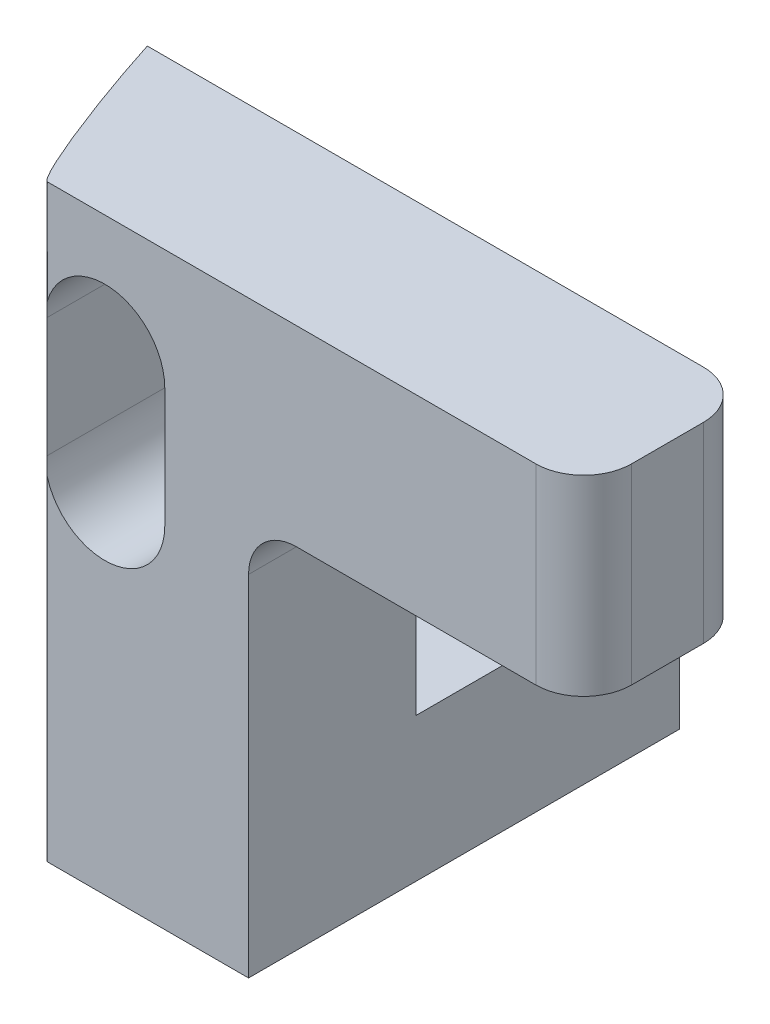
ISO-10303-21;
HEADER;
FILE_DESCRIPTION(('STEP AP214'),'2;1');
FILE_NAME('part.step','',(''),(''),'','','');
FILE_SCHEMA(('AUTOMOTIVE_DESIGN { 1 0 10303 214 1 1 1 1 }'));
ENDSEC;
DATA;
#1=APPLICATION_CONTEXT('core data for automotive mechanical design processes');
#2=APPLICATION_PROTOCOL_DEFINITION('international standard','automotive_design',2000,#1);
#3=PRODUCT_CONTEXT('',#1,'mechanical');
#4=PRODUCT('Part','Part','',(#3));
#5=PRODUCT_RELATED_PRODUCT_CATEGORY('part','',(#4));
#6=PRODUCT_DEFINITION_FORMATION('','',#4);
#7=PRODUCT_DEFINITION_CONTEXT('part definition',#1,'design');
#8=PRODUCT_DEFINITION('design','',#6,#7);
#9=PRODUCT_DEFINITION_SHAPE('','',#8);
#10=(LENGTH_UNIT() NAMED_UNIT(*) SI_UNIT(.MILLI.,.METRE.));
#11=(NAMED_UNIT(*) PLANE_ANGLE_UNIT() SI_UNIT($,.RADIAN.));
#12=(NAMED_UNIT(*) SI_UNIT($,.STERADIAN.) SOLID_ANGLE_UNIT());
#13=UNCERTAINTY_MEASURE_WITH_UNIT(LENGTH_MEASURE(1.E-05),#10,'distance_accuracy_value','');
#14=(GEOMETRIC_REPRESENTATION_CONTEXT(3) GLOBAL_UNCERTAINTY_ASSIGNED_CONTEXT((#13)) GLOBAL_UNIT_ASSIGNED_CONTEXT((#10,
#11,#12)) REPRESENTATION_CONTEXT('',''));
#15=CARTESIAN_POINT('',(0.,0.,0.));
#16=DIRECTION('',(0.,0.,1.));
#17=DIRECTION('',(1.,0.,0.));
#18=AXIS2_PLACEMENT_3D('',#15,#16,#17);
#19=CARTESIAN_POINT('',(0.,3.,0.));
#20=DIRECTION('',(0.,-1.,0.));
#21=DIRECTION('',(0.,0.,-1.));
#22=AXIS2_PLACEMENT_3D('',#19,#20,#21);
#23=PLANE('',#22);
#24=CARTESIAN_POINT('',(0.,3.,0.));
#25=DIRECTION('',(0.,1.,0.));
#26=DIRECTION('',(0.,0.,1.));
#27=AXIS2_PLACEMENT_3D('',#24,#25,#26);
#28=CIRCLE('',#27,1.5);
#29=CARTESIAN_POINT('',(0.,3.,1.5));
#30=VERTEX_POINT('',#29);
#31=EDGE_CURVE('E344',#30,#30,#28,.T.);
#32=ORIENTED_EDGE('',*,*,#31,.F.);
#33=EDGE_LOOP('',(#32));
#34=FACE_BOUND('',#33,.T.);
#35=DIRECTION('',(0.,0.,1.));
#36=VECTOR('',#35,1.);
#37=CARTESIAN_POINT('',(-3.,3.,6.5));
#38=LINE('',#37,#36);
#39=CARTESIAN_POINT('',(-3.,3.,-1.5));
#40=VERTEX_POINT('',#39);
#41=CARTESIAN_POINT('',(-3.,3.,1.5));
#42=VERTEX_POINT('',#41);
#43=EDGE_CURVE('E354',#40,#42,#38,.T.);
#44=ORIENTED_EDGE('',*,*,#43,.T.);
#45=CARTESIAN_POINT('',(-1.2,3.,6.5));
#46=CARTESIAN_POINT('',(-3.,3.,6.5));
#47=CARTESIAN_POINT('',(-3.,3.,1.5));
#48=(BOUNDED_CURVE() B_SPLINE_CURVE(2,(#45,#46,#47),.UNSPECIFIED.,.F.,
.F.) B_SPLINE_CURVE_WITH_KNOTS((3,3),(0.,1.),
.UNSPECIFIED.) CURVE() GEOMETRIC_REPRESENTATION_ITEM() RATIONAL_B_SPLINE_CURVE((1.,
0.111111111111111,1.)) REPRESENTATION_ITEM(''));
#49=CARTESIAN_POINT('',(-2.6148133392298,3.,3.));
#50=VERTEX_POINT('',#49);
#51=EDGE_CURVE('E67',#42,#50,#48,.F.);
#52=ORIENTED_EDGE('',*,*,#51,.T.);
#53=DIRECTION('',(-1.,0.,0.));
#54=VECTOR('',#53,1.);
#55=CARTESIAN_POINT('',(-3.,3.,3.));
#56=LINE('',#55,#54);
#57=CARTESIAN_POINT('',(3.,3.,3.));
#58=VERTEX_POINT('',#57);
#59=EDGE_CURVE('E327',#58,#50,#56,.T.);
#60=ORIENTED_EDGE('',*,*,#59,.F.);
#61=DIRECTION('',(0.,0.,-1.));
#62=VECTOR('',#61,1.);
#63=CARTESIAN_POINT('',(3.,3.,6.5));
#64=LINE('',#63,#62);
#65=CARTESIAN_POINT('',(3.,3.,-2.5));
#66=VERTEX_POINT('',#65);
#67=EDGE_CURVE('E292',#58,#66,#64,.T.);
#68=ORIENTED_EDGE('',*,*,#67,.T.);
#69=DIRECTION('',(-1.,0.,0.));
#70=VECTOR('',#69,1.);
#71=CARTESIAN_POINT('',(-3.,3.,-2.5));
#72=LINE('',#71,#70);
#73=CARTESIAN_POINT('',(-2.,3.,-2.5));
#74=VERTEX_POINT('',#73);
#75=EDGE_CURVE('E351',#66,#74,#72,.T.);
#76=ORIENTED_EDGE('',*,*,#75,.T.);
#77=CARTESIAN_POINT('',(-2.,3.,-1.5));
#78=DIRECTION('',(0.,-1.,0.));
#79=DIRECTION('',(0.,0.,-1.));
#80=AXIS2_PLACEMENT_3D('',#77,#78,#79);
#81=CIRCLE('',#80,1.);
#82=EDGE_CURVE('E383',#74,#40,#81,.F.);
#83=ORIENTED_EDGE('',*,*,#82,.T.);
#84=EDGE_LOOP('',(#44,#52,#60,#68,#76,#83));
#85=FACE_BOUND('',#84,.T.);
#86=ADVANCED_FACE('F38',(#34,#85),#23,.F.);
#87=CARTESIAN_POINT('',(0.,0.,0.));
#88=DIRECTION('',(0.,-1.,0.));
#89=DIRECTION('',(0.,0.,-1.));
#90=AXIS2_PLACEMENT_3D('',#87,#88,#89);
#91=PLANE('',#90);
#92=DIRECTION('',(1.,0.,0.));
#93=VECTOR('',#92,1.);
#94=CARTESIAN_POINT('',(-3.,0.,6.5));
#95=LINE('',#94,#93);
#96=CARTESIAN_POINT('',(-1.2,0.,6.5));
#97=VERTEX_POINT('',#96);
#98=CARTESIAN_POINT('',(3.,0.,6.5));
#99=VERTEX_POINT('',#98);
#100=EDGE_CURVE('E278',#97,#99,#95,.T.);
#101=ORIENTED_EDGE('',*,*,#100,.F.);
#102=CARTESIAN_POINT('',(-3.,0.,1.5));
#103=CARTESIAN_POINT('',(-3.,0.,6.5));
#104=CARTESIAN_POINT('',(-1.2,0.,6.5));
#105=(BOUNDED_CURVE() B_SPLINE_CURVE(2,(#102,#103,#104),.UNSPECIFIED.,.F.,
.F.) B_SPLINE_CURVE_WITH_KNOTS((3,3),(0.,1.),
.UNSPECIFIED.) CURVE() GEOMETRIC_REPRESENTATION_ITEM() RATIONAL_B_SPLINE_CURVE((1.,
0.111111111111111,1.)) REPRESENTATION_ITEM(''));
#106=CARTESIAN_POINT('',(-3.,0.,1.5));
#107=VERTEX_POINT('',#106);
#108=EDGE_CURVE('E420',#97,#107,#105,.F.);
#109=ORIENTED_EDGE('',*,*,#108,.T.);
#110=DIRECTION('',(0.,0.,1.));
#111=VECTOR('',#110,1.);
#112=CARTESIAN_POINT('',(-3.,0.,6.5));
#113=LINE('',#112,#111);
#114=CARTESIAN_POINT('',(-3.,0.,-1.5));
#115=VERTEX_POINT('',#114);
#116=EDGE_CURVE('E269',#115,#107,#113,.T.);
#117=ORIENTED_EDGE('',*,*,#116,.F.);
#118=CARTESIAN_POINT('',(-2.,0.,-1.5));
#119=DIRECTION('',(0.,-1.,0.));
#120=DIRECTION('',(0.,0.,-1.));
#121=AXIS2_PLACEMENT_3D('',#118,#119,#120);
#122=CIRCLE('',#121,1.);
#123=CARTESIAN_POINT('',(-2.,0.,-2.5));
#124=VERTEX_POINT('',#123);
#125=EDGE_CURVE('E377',#115,#124,#122,.T.);
#126=ORIENTED_EDGE('',*,*,#125,.T.);
#127=DIRECTION('',(-1.,0.,0.));
#128=VECTOR('',#127,1.);
#129=CARTESIAN_POINT('',(-3.,0.,-2.5));
#130=LINE('',#129,#128);
#131=CARTESIAN_POINT('',(3.,0.,-2.5));
#132=VERTEX_POINT('',#131);
#133=EDGE_CURVE('E279',#132,#124,#130,.T.);
#134=ORIENTED_EDGE('',*,*,#133,.F.);
#135=DIRECTION('',(0.,0.,-1.));
#136=VECTOR('',#135,1.);
#137=CARTESIAN_POINT('',(3.,0.,6.5));
#138=LINE('',#137,#136);
#139=EDGE_CURVE('E347',#99,#132,#138,.T.);
#140=ORIENTED_EDGE('',*,*,#139,.F.);
#141=EDGE_LOOP('',(#101,#109,#117,#126,#134,#140));
#142=FACE_BOUND('',#141,.T.);
#143=CARTESIAN_POINT('',(0.,0.,0.));
#144=DIRECTION('',(0.,1.,0.));
#145=DIRECTION('',(0.,0.,1.));
#146=AXIS2_PLACEMENT_3D('',#143,#144,#145);
#147=CIRCLE('',#146,1.5);
#148=CARTESIAN_POINT('',(0.,0.,1.5));
#149=VERTEX_POINT('',#148);
#150=EDGE_CURVE('E343',#149,#149,#147,.T.);
#151=ORIENTED_EDGE('',*,*,#150,.T.);
#152=EDGE_LOOP('',(#151));
#153=FACE_BOUND('',#152,.T.);
#154=ADVANCED_FACE('F311',(#142,#153),#91,.T.);
#155=CARTESIAN_POINT('',(3.,3.,6.5));
#156=DIRECTION('',(-1.,0.,0.));
#157=DIRECTION('',(0.,0.,1.));
#158=AXIS2_PLACEMENT_3D('',#155,#156,#157);
#159=PLANE('',#158);
#160=DIRECTION('',(0.,-1.,0.));
#161=VECTOR('',#160,1.);
#162=CARTESIAN_POINT('',(3.,8.3,3.));
#163=LINE('',#162,#161);
#164=CARTESIAN_POINT('',(3.,7.3,3.));
#165=VERTEX_POINT('',#164);
#166=EDGE_CURVE('E334',#165,#58,#163,.T.);
#167=ORIENTED_EDGE('',*,*,#166,.F.);
#168=DIRECTION('',(0.,0.,-1.));
#169=VECTOR('',#168,1.);
#170=CARTESIAN_POINT('',(3.,7.3,6.5));
#171=LINE('',#170,#169);
#172=CARTESIAN_POINT('',(3.,7.3,6.5));
#173=VERTEX_POINT('',#172);
#174=EDGE_CURVE('E388',#165,#173,#171,.F.);
#175=ORIENTED_EDGE('',*,*,#174,.T.);
#176=DIRECTION('',(0.,-1.,0.));
#177=VECTOR('',#176,1.);
#178=CARTESIAN_POINT('',(3.,3.,6.5));
#179=LINE('',#178,#177);
#180=EDGE_CURVE('E287',#173,#99,#179,.T.);
#181=ORIENTED_EDGE('',*,*,#180,.T.);
#182=ORIENTED_EDGE('',*,*,#139,.T.);
#183=DIRECTION('',(0.,-1.,0.));
#184=VECTOR('',#183,1.);
#185=CARTESIAN_POINT('',(3.,3.,-2.5));
#186=LINE('',#185,#184);
#187=EDGE_CURVE('E365',#66,#132,#186,.T.);
#188=ORIENTED_EDGE('',*,*,#187,.F.);
#189=ORIENTED_EDGE('',*,*,#67,.F.);
#190=EDGE_LOOP('',(#167,#175,#181,#182,#188,#189));
#191=FACE_BOUND('',#190,.T.);
#192=ADVANCED_FACE('F509',(#191),#159,.F.);
#193=CARTESIAN_POINT('',(-3.,3.,-2.5));
#194=DIRECTION('',(0.,0.,1.));
#195=DIRECTION('',(1.,0.,0.));
#196=AXIS2_PLACEMENT_3D('',#193,#194,#195);
#197=PLANE('',#196);
#198=ORIENTED_EDGE('',*,*,#133,.T.);
#199=DIRECTION('',(0.,-1.,0.));
#200=VECTOR('',#199,1.);
#201=CARTESIAN_POINT('',(-2.,3.,-2.5));
#202=LINE('',#201,#200);
#203=EDGE_CURVE('E381',#124,#74,#202,.F.);
#204=ORIENTED_EDGE('',*,*,#203,.T.);
#205=ORIENTED_EDGE('',*,*,#75,.F.);
#206=ORIENTED_EDGE('',*,*,#187,.T.);
#207=EDGE_LOOP('',(#198,#204,#205,#206));
#208=FACE_BOUND('',#207,.T.);
#209=ADVANCED_FACE('F318',(#208),#197,.F.);
#210=CARTESIAN_POINT('',(-3.,3.,6.5));
#211=DIRECTION('',(1.,0.,0.));
#212=DIRECTION('',(0.,0.,-1.));
#213=AXIS2_PLACEMENT_3D('',#210,#211,#212);
#214=PLANE('',#213);
#215=ORIENTED_EDGE('',*,*,#116,.T.);
#216=CARTESIAN_POINT('',(-3.,12.915,1.5));
#217=CARTESIAN_POINT('',(-3.,8.40499999999999,1.5));
#218=CARTESIAN_POINT('',(-3.,3.895,1.5));
#219=CARTESIAN_POINT('',(-3.,-0.615000000000001,1.5));
#220=(BOUNDED_CURVE() B_SPLINE_CURVE(3,(#216,#217,#218,#219),.UNSPECIFIED.,.F.,
.F.) B_SPLINE_CURVE_WITH_KNOTS((4,4),(-0.009915,0.003615),
.UNSPECIFIED.) CURVE() GEOMETRIC_REPRESENTATION_ITEM() RATIONAL_B_SPLINE_CURVE((1.,1.,1.,1.)) REPRESENTATION_ITEM(''));
#221=EDGE_CURVE('E497',#107,#42,#220,.F.);
#222=ORIENTED_EDGE('',*,*,#221,.T.);
#223=ORIENTED_EDGE('',*,*,#43,.F.);
#224=DIRECTION('',(0.,-1.,0.));
#225=VECTOR('',#224,1.);
#226=CARTESIAN_POINT('',(-3.,3.,-1.5));
#227=LINE('',#226,#225);
#228=EDGE_CURVE('E371',#40,#115,#227,.T.);
#229=ORIENTED_EDGE('',*,*,#228,.T.);
#230=EDGE_LOOP('',(#215,#222,#223,#229));
#231=FACE_BOUND('',#230,.T.);
#232=ADVANCED_FACE('F310',(#231),#214,.F.);
#233=CARTESIAN_POINT('',(-3.,3.,6.5));
#234=DIRECTION('',(0.,0.,-1.));
#235=DIRECTION('',(-1.,0.,0.));
#236=AXIS2_PLACEMENT_3D('',#233,#234,#235);
#237=PLANE('',#236);
#238=DIRECTION('',(1.,0.,0.));
#239=VECTOR('',#238,1.);
#240=CARTESIAN_POINT('',(-3.,12.3,6.5));
#241=LINE('',#240,#239);
#242=CARTESIAN_POINT('',(-1.2,12.3,6.5));
#243=VERTEX_POINT('',#242);
#244=CARTESIAN_POINT('',(8.99999999999999,12.3,6.5));
#245=VERTEX_POINT('',#244);
#246=EDGE_CURVE('E293',#243,#245,#241,.T.);
#247=ORIENTED_EDGE('',*,*,#246,.F.);
#248=CARTESIAN_POINT('',(-1.2,-0.615000000000001,6.5));
#249=CARTESIAN_POINT('',(-1.2,3.895,6.5));
#250=CARTESIAN_POINT('',(-1.2,8.40499999999999,6.5));
#251=CARTESIAN_POINT('',(-1.2,12.915,6.5));
#252=(BOUNDED_CURVE() B_SPLINE_CURVE(3,(#248,#249,#250,#251),.UNSPECIFIED.,.F.,
.F.) B_SPLINE_CURVE_WITH_KNOTS((4,4),(-0.009915,0.003615),
.UNSPECIFIED.) CURVE() GEOMETRIC_REPRESENTATION_ITEM() RATIONAL_B_SPLINE_CURVE((1.,1.,1.,1.)) REPRESENTATION_ITEM(''));
#253=CARTESIAN_POINT('',(-1.20000006481981,10.1499997777606,6.5));
#254=VERTEX_POINT('',#253);
#255=EDGE_CURVE('E181',#243,#254,#252,.F.);
#256=ORIENTED_EDGE('',*,*,#255,.T.);
#257=CARTESIAN_POINT('',(0.,9.8,6.5));
#258=DIRECTION('',(0.,0.,-1.));
#259=DIRECTION('',(-1.,0.,0.));
#260=AXIS2_PLACEMENT_3D('',#257,#258,#259);
#261=CIRCLE('',#260,1.25);
#262=CARTESIAN_POINT('',(1.25,9.8,6.5));
#263=VERTEX_POINT('',#262);
#264=EDGE_CURVE('E173',#254,#263,#261,.T.);
#265=ORIENTED_EDGE('',*,*,#264,.T.);
#266=DIRECTION('',(0.,-1.,0.));
#267=VECTOR('',#266,1.);
#268=CARTESIAN_POINT('',(1.25,7.3,6.5));
#269=LINE('',#268,#267);
#270=CARTESIAN_POINT('',(1.25,7.3,6.5));
#271=VERTEX_POINT('',#270);
#272=EDGE_CURVE('E179',#263,#271,#269,.T.);
#273=ORIENTED_EDGE('',*,*,#272,.T.);
#274=CARTESIAN_POINT('',(0.,7.3,6.5));
#275=DIRECTION('',(0.,0.,-1.));
#276=DIRECTION('',(-1.,0.,0.));
#277=AXIS2_PLACEMENT_3D('',#274,#275,#276);
#278=CIRCLE('',#277,1.25);
#279=CARTESIAN_POINT('',(-1.20000000315208,6.95000001080713,6.5));
#280=VERTEX_POINT('',#279);
#281=EDGE_CURVE('E184',#271,#280,#278,.T.);
#282=ORIENTED_EDGE('',*,*,#281,.T.);
#283=CARTESIAN_POINT('',(-1.2,-0.615000000000001,6.5));
#284=CARTESIAN_POINT('',(-1.2,3.895,6.5));
#285=CARTESIAN_POINT('',(-1.2,8.40499999999999,6.5));
#286=CARTESIAN_POINT('',(-1.2,12.915,6.5));
#287=(BOUNDED_CURVE() B_SPLINE_CURVE(3,(#283,#284,#285,#286),.UNSPECIFIED.,.F.,
.F.) B_SPLINE_CURVE_WITH_KNOTS((4,4),(-0.009915,0.003615),
.UNSPECIFIED.) CURVE() GEOMETRIC_REPRESENTATION_ITEM() RATIONAL_B_SPLINE_CURVE((1.,1.,1.,1.)) REPRESENTATION_ITEM(''));
#288=EDGE_CURVE('E296',#280,#97,#287,.F.);
#289=ORIENTED_EDGE('',*,*,#288,.T.);
#290=ORIENTED_EDGE('',*,*,#100,.T.);
#291=ORIENTED_EDGE('',*,*,#180,.F.);
#292=CARTESIAN_POINT('',(4.,7.3,6.5));
#293=DIRECTION('',(0.,0.,-1.));
#294=DIRECTION('',(-1.,0.,0.));
#295=AXIS2_PLACEMENT_3D('',#292,#293,#294);
#296=CIRCLE('',#295,1.);
#297=CARTESIAN_POINT('',(4.,8.3,6.5));
#298=VERTEX_POINT('',#297);
#299=EDGE_CURVE('E392',#173,#298,#296,.T.);
#300=ORIENTED_EDGE('',*,*,#299,.T.);
#301=DIRECTION('',(1.,0.,0.));
#302=VECTOR('',#301,1.);
#303=CARTESIAN_POINT('',(-3.,8.3,6.5));
#304=LINE('',#303,#302);
#305=CARTESIAN_POINT('',(8.99999999999999,8.3,6.5));
#306=VERTEX_POINT('',#305);
#307=EDGE_CURVE('E215',#298,#306,#304,.T.);
#308=ORIENTED_EDGE('',*,*,#307,.T.);
#309=DIRECTION('',(0.,-1.,0.));
#310=VECTOR('',#309,1.);
#311=CARTESIAN_POINT('',(9.,3.,6.5));
#312=LINE('',#311,#310);
#313=EDGE_CURVE('E403',#306,#245,#312,.F.);
#314=ORIENTED_EDGE('',*,*,#313,.T.);
#315=EDGE_LOOP('',(#247,#256,#265,#273,#282,#289,#290,#291,#300,#308,#314));
#316=FACE_BOUND('',#315,.T.);
#317=ADVANCED_FACE('F176',(#316),#237,.F.);
#318=CARTESIAN_POINT('',(0.,3.,0.));
#319=DIRECTION('',(0.,-1.,0.));
#320=DIRECTION('',(0.,0.,-1.));
#321=AXIS2_PLACEMENT_3D('',#318,#319,#320);
#322=CYLINDRICAL_SURFACE('',#321,1.5);
#323=ORIENTED_EDGE('',*,*,#31,.T.);
#324=EDGE_LOOP('',(#323));
#325=FACE_BOUND('',#324,.T.);
#326=ORIENTED_EDGE('',*,*,#150,.F.);
#327=EDGE_LOOP('',(#326));
#328=FACE_BOUND('',#327,.T.);
#329=ADVANCED_FACE('F309',(#325,#328),#322,.F.);
#330=CARTESIAN_POINT('',(-3.,8.3,3.));
#331=DIRECTION('',(0.,0.,1.));
#332=DIRECTION('',(1.,0.,0.));
#333=AXIS2_PLACEMENT_3D('',#330,#331,#332);
#334=PLANE('',#333);
#335=DIRECTION('',(0.,1.,0.));
#336=VECTOR('',#335,1.);
#337=CARTESIAN_POINT('',(-1.25,7.3,3.));
#338=LINE('',#337,#336);
#339=CARTESIAN_POINT('',(-1.25,7.3,3.));
#340=VERTEX_POINT('',#339);
#341=CARTESIAN_POINT('',(-1.25,9.8,3.));
#342=VERTEX_POINT('',#341);
#343=EDGE_CURVE('E209',#340,#342,#338,.T.);
#344=ORIENTED_EDGE('',*,*,#343,.F.);
#345=CARTESIAN_POINT('',(0.,7.3,3.));
#346=DIRECTION('',(0.,0.,-1.));
#347=DIRECTION('',(-1.,0.,0.));
#348=AXIS2_PLACEMENT_3D('',#345,#346,#347);
#349=CIRCLE('',#348,1.25);
#350=CARTESIAN_POINT('',(1.25,7.3,3.));
#351=VERTEX_POINT('',#350);
#352=EDGE_CURVE('E206',#351,#340,#349,.T.);
#353=ORIENTED_EDGE('',*,*,#352,.F.);
#354=DIRECTION('',(0.,-1.,0.));
#355=VECTOR('',#354,1.);
#356=CARTESIAN_POINT('',(1.25,7.3,3.));
#357=LINE('',#356,#355);
#358=CARTESIAN_POINT('',(1.25,9.8,3.));
#359=VERTEX_POINT('',#358);
#360=EDGE_CURVE('E213',#359,#351,#357,.T.);
#361=ORIENTED_EDGE('',*,*,#360,.F.);
#362=CARTESIAN_POINT('',(0.,9.8,3.));
#363=DIRECTION('',(0.,0.,-1.));
#364=DIRECTION('',(-1.,0.,0.));
#365=AXIS2_PLACEMENT_3D('',#362,#363,#364);
#366=CIRCLE('',#365,1.25);
#367=EDGE_CURVE('E190',#342,#359,#366,.T.);
#368=ORIENTED_EDGE('',*,*,#367,.F.);
#369=EDGE_LOOP('',(#344,#353,#361,#368));
#370=FACE_BOUND('',#369,.T.);
#371=ORIENTED_EDGE('',*,*,#59,.T.);
#372=CARTESIAN_POINT('',(-2.61481333922978,12.915,3.00000000000003));
#373=CARTESIAN_POINT('',(-2.61481333922978,8.40499999999999,3.00000000000003));
#374=CARTESIAN_POINT('',(-2.61481333922978,3.895,3.00000000000003));
#375=CARTESIAN_POINT('',(-2.61481333922978,-0.615000000000001,3.00000000000003));
#376=(BOUNDED_CURVE() B_SPLINE_CURVE(3,(#372,#373,#374,#375),.UNSPECIFIED.,.F.,
.F.) B_SPLINE_CURVE_WITH_KNOTS((4,4),(-0.009915,0.003615),
.UNSPECIFIED.) CURVE() GEOMETRIC_REPRESENTATION_ITEM() RATIONAL_B_SPLINE_CURVE((0.592396255635113,
0.592396255635113,0.592396255635113,0.592396255635113)) REPRESENTATION_ITEM(''));
#377=CARTESIAN_POINT('',(-2.6148133392298,12.3,3.));
#378=VERTEX_POINT('',#377);
#379=EDGE_CURVE('E52',#50,#378,#376,.F.);
#380=ORIENTED_EDGE('',*,*,#379,.T.);
#381=DIRECTION('',(-1.,0.,0.));
#382=VECTOR('',#381,1.);
#383=CARTESIAN_POINT('',(-3.,12.3,3.));
#384=LINE('',#383,#382);
#385=CARTESIAN_POINT('',(8.99999999999999,12.3,3.));
#386=VERTEX_POINT('',#385);
#387=EDGE_CURVE('E335',#386,#378,#384,.T.);
#388=ORIENTED_EDGE('',*,*,#387,.F.);
#389=DIRECTION('',(0.,-1.,0.));
#390=VECTOR('',#389,1.);
#391=CARTESIAN_POINT('',(9.,8.3,3.));
#392=LINE('',#391,#390);
#393=CARTESIAN_POINT('',(8.99999999999999,8.3,3.));
#394=VERTEX_POINT('',#393);
#395=EDGE_CURVE('E410',#386,#394,#392,.T.);
#396=ORIENTED_EDGE('',*,*,#395,.T.);
#397=DIRECTION('',(-1.,0.,0.));
#398=VECTOR('',#397,1.);
#399=CARTESIAN_POINT('',(-3.,8.3,3.));
#400=LINE('',#399,#398);
#401=CARTESIAN_POINT('',(4.,8.3,3.));
#402=VERTEX_POINT('',#401);
#403=EDGE_CURVE('E340',#394,#402,#400,.T.);
#404=ORIENTED_EDGE('',*,*,#403,.T.);
#405=CARTESIAN_POINT('',(4.,7.3,3.));
#406=DIRECTION('',(0.,0.,1.));
#407=DIRECTION('',(1.,0.,0.));
#408=AXIS2_PLACEMENT_3D('',#405,#406,#407);
#409=CIRCLE('',#408,1.);
#410=EDGE_CURVE('E390',#402,#165,#409,.T.);
#411=ORIENTED_EDGE('',*,*,#410,.T.);
#412=ORIENTED_EDGE('',*,*,#166,.T.);
#413=EDGE_LOOP('',(#371,#380,#388,#396,#404,#411,#412));
#414=FACE_BOUND('',#413,.T.);
#415=ADVANCED_FACE('F503',(#370,#414),#334,.F.);
#416=CARTESIAN_POINT('',(10.,12.3,6.5));
#417=DIRECTION('',(-1.,0.,0.));
#418=DIRECTION('',(0.,0.,1.));
#419=AXIS2_PLACEMENT_3D('',#416,#417,#418);
#420=PLANE('',#419);
#421=DIRECTION('',(0.,0.,-1.));
#422=VECTOR('',#421,1.);
#423=CARTESIAN_POINT('',(10.,12.3,6.5));
#424=LINE('',#423,#422);
#425=CARTESIAN_POINT('',(10.,12.3,5.5));
#426=VERTEX_POINT('',#425);
#427=CARTESIAN_POINT('',(10.,12.3,4.));
#428=VERTEX_POINT('',#427);
#429=EDGE_CURVE('E540',#426,#428,#424,.T.);
#430=ORIENTED_EDGE('',*,*,#429,.F.);
#431=DIRECTION('',(0.,-1.,0.));
#432=VECTOR('',#431,1.);
#433=CARTESIAN_POINT('',(10.,12.3,5.5));
#434=LINE('',#433,#432);
#435=CARTESIAN_POINT('',(10.,8.3,5.5));
#436=VERTEX_POINT('',#435);
#437=EDGE_CURVE('E396',#426,#436,#434,.T.);
#438=ORIENTED_EDGE('',*,*,#437,.T.);
#439=DIRECTION('',(0.,0.,-1.));
#440=VECTOR('',#439,1.);
#441=CARTESIAN_POINT('',(10.,8.3,6.5));
#442=LINE('',#441,#440);
#443=CARTESIAN_POINT('',(10.,8.3,4.));
#444=VERTEX_POINT('',#443);
#445=EDGE_CURVE('E546',#436,#444,#442,.T.);
#446=ORIENTED_EDGE('',*,*,#445,.T.);
#447=DIRECTION('',(0.,-1.,0.));
#448=VECTOR('',#447,1.);
#449=CARTESIAN_POINT('',(10.,12.3,4.));
#450=LINE('',#449,#448);
#451=EDGE_CURVE('E394',#444,#428,#450,.F.);
#452=ORIENTED_EDGE('',*,*,#451,.T.);
#453=EDGE_LOOP('',(#430,#438,#446,#452));
#454=FACE_BOUND('',#453,.T.);
#455=ADVANCED_FACE('F505',(#454),#420,.F.);
#456=CARTESIAN_POINT('',(0.,12.3,0.));
#457=DIRECTION('',(0.,-1.,0.));
#458=DIRECTION('',(0.,0.,-1.));
#459=AXIS2_PLACEMENT_3D('',#456,#457,#458);
#460=PLANE('',#459);
#461=ORIENTED_EDGE('',*,*,#387,.T.);
#462=CARTESIAN_POINT('',(-1.2,12.3,6.5));
#463=CARTESIAN_POINT('',(-3.,12.3,6.5));
#464=CARTESIAN_POINT('',(-3.,12.3,1.5));
#465=(BOUNDED_CURVE() B_SPLINE_CURVE(2,(#462,#463,#464),.UNSPECIFIED.,.F.,
.F.) B_SPLINE_CURVE_WITH_KNOTS((3,3),(0.,1.),
.UNSPECIFIED.) CURVE() GEOMETRIC_REPRESENTATION_ITEM() RATIONAL_B_SPLINE_CURVE((1.,
0.111111111111111,1.)) REPRESENTATION_ITEM(''));
#466=EDGE_CURVE('E12',#378,#243,#465,.F.);
#467=ORIENTED_EDGE('',*,*,#466,.T.);
#468=ORIENTED_EDGE('',*,*,#246,.T.);
#469=CARTESIAN_POINT('',(9.,12.3,5.5));
#470=DIRECTION('',(0.,-1.,0.));
#471=DIRECTION('',(0.,0.,-1.));
#472=AXIS2_PLACEMENT_3D('',#469,#470,#471);
#473=CIRCLE('',#472,1.);
#474=EDGE_CURVE('E408',#245,#426,#473,.F.);
#475=ORIENTED_EDGE('',*,*,#474,.T.);
#476=ORIENTED_EDGE('',*,*,#429,.T.);
#477=CARTESIAN_POINT('',(9.,12.3,4.));
#478=DIRECTION('',(0.,-1.,0.));
#479=DIRECTION('',(0.,0.,-1.));
#480=AXIS2_PLACEMENT_3D('',#477,#478,#479);
#481=CIRCLE('',#480,1.);
#482=EDGE_CURVE('E406',#428,#386,#481,.F.);
#483=ORIENTED_EDGE('',*,*,#482,.T.);
#484=EDGE_LOOP('',(#461,#467,#468,#475,#476,#483));
#485=FACE_BOUND('',#484,.T.);
#486=ADVANCED_FACE('F557',(#485),#460,.F.);
#487=CARTESIAN_POINT('',(0.,8.3,0.));
#488=DIRECTION('',(0.,-1.,0.));
#489=DIRECTION('',(0.,0.,-1.));
#490=AXIS2_PLACEMENT_3D('',#487,#488,#489);
#491=PLANE('',#490);
#492=ORIENTED_EDGE('',*,*,#445,.F.);
#493=CARTESIAN_POINT('',(9.,8.3,5.5));
#494=DIRECTION('',(0.,-1.,0.));
#495=DIRECTION('',(0.,0.,-1.));
#496=AXIS2_PLACEMENT_3D('',#493,#494,#495);
#497=CIRCLE('',#496,1.);
#498=EDGE_CURVE('E401',#436,#306,#497,.T.);
#499=ORIENTED_EDGE('',*,*,#498,.T.);
#500=ORIENTED_EDGE('',*,*,#307,.F.);
#501=DIRECTION('',(0.,0.,-1.));
#502=VECTOR('',#501,1.);
#503=CARTESIAN_POINT('',(4.,8.3,0.));
#504=LINE('',#503,#502);
#505=EDGE_CURVE('E385',#298,#402,#504,.T.);
#506=ORIENTED_EDGE('',*,*,#505,.T.);
#507=ORIENTED_EDGE('',*,*,#403,.F.);
#508=CARTESIAN_POINT('',(9.,8.3,4.));
#509=DIRECTION('',(0.,-1.,0.));
#510=DIRECTION('',(0.,0.,-1.));
#511=AXIS2_PLACEMENT_3D('',#508,#509,#510);
#512=CIRCLE('',#511,1.);
#513=EDGE_CURVE('E399',#394,#444,#512,.T.);
#514=ORIENTED_EDGE('',*,*,#513,.T.);
#515=EDGE_LOOP('',(#492,#499,#500,#506,#507,#514));
#516=FACE_BOUND('',#515,.T.);
#517=ADVANCED_FACE('F564',(#516),#491,.T.);
#518=CARTESIAN_POINT('',(-2.,3.,-1.5));
#519=DIRECTION('',(0.,-1.,0.));
#520=DIRECTION('',(0.,0.,-1.));
#521=AXIS2_PLACEMENT_3D('',#518,#519,#520);
#522=CYLINDRICAL_SURFACE('',#521,1.);
#523=ORIENTED_EDGE('',*,*,#82,.F.);
#524=ORIENTED_EDGE('',*,*,#203,.F.);
#525=ORIENTED_EDGE('',*,*,#125,.F.);
#526=ORIENTED_EDGE('',*,*,#228,.F.);
#527=EDGE_LOOP('',(#523,#524,#525,#526));
#528=FACE_BOUND('',#527,.T.);
#529=ADVANCED_FACE('F514',(#528),#522,.T.);
#530=CARTESIAN_POINT('',(4.,7.3,0.));
#531=DIRECTION('',(0.,0.,-1.));
#532=DIRECTION('',(-1.,0.,0.));
#533=AXIS2_PLACEMENT_3D('',#530,#531,#532);
#534=CYLINDRICAL_SURFACE('',#533,1.);
#535=ORIENTED_EDGE('',*,*,#299,.F.);
#536=ORIENTED_EDGE('',*,*,#174,.F.);
#537=ORIENTED_EDGE('',*,*,#410,.F.);
#538=ORIENTED_EDGE('',*,*,#505,.F.);
#539=EDGE_LOOP('',(#535,#536,#537,#538));
#540=FACE_BOUND('',#539,.T.);
#541=ADVANCED_FACE('F569',(#540),#534,.F.);
#542=CARTESIAN_POINT('',(0.,7.3,6.5));
#543=DIRECTION('',(0.,0.,-1.));
#544=DIRECTION('',(-1.,0.,0.));
#545=AXIS2_PLACEMENT_3D('',#542,#543,#544);
#546=CYLINDRICAL_SURFACE('',#545,1.25);
#547=DIRECTION('',(0.,0.,-1.));
#548=VECTOR('',#547,1.);
#549=CARTESIAN_POINT('',(-1.25,7.3,6.5));
#550=LINE('',#549,#548);
#551=CARTESIAN_POINT('',(-1.25,7.3,6.45959577945232));
#552=VERTEX_POINT('',#551);
#553=EDGE_CURVE('E199',#552,#340,#550,.T.);
#554=ORIENTED_EDGE('',*,*,#553,.F.);
#555=CARTESIAN_POINT('',(-1.20000000315208,6.95000001080714,6.5));
#556=CARTESIAN_POINT('',(-1.20143988448079,6.95493351942998,6.49999433676144));
#557=CARTESIAN_POINT('',(-1.20286395550284,6.95986561043329,6.49980598572598));
#558=CARTESIAN_POINT('',(-1.20575975135954,6.97004488583404,6.49913055548687));
#559=CARTESIAN_POINT('',(-1.20722856043258,6.97529172137746,6.49862486160085));
#560=CARTESIAN_POINT('',(-1.21019094010013,6.98609899200372,6.49736743427227));
#561=CARTESIAN_POINT('',(-1.21168047983137,6.99165887224524,6.49660248407001));
#562=CARTESIAN_POINT('',(-1.21466332994811,7.00309301741166,6.49487120259674));
#563=CARTESIAN_POINT('',(-1.21615199869491,7.00896710537872,6.49389586622132));
#564=CARTESIAN_POINT('',(-1.22070145061382,7.02751372327318,6.49066769924427));
#565=CARTESIAN_POINT('',(-1.22359081165804,7.04019758355727,6.48824116171033));
#566=CARTESIAN_POINT('',(-1.22915037367072,7.06681993794964,6.48318027813551));
#567=CARTESIAN_POINT('',(-1.23177681571615,7.08076772613086,6.48054708073624));
#568=CARTESIAN_POINT('',(-1.23666044097544,7.10991889489773,6.47541326944327));
#569=CARTESIAN_POINT('',(-1.23887240268364,7.1251348300491,6.47293932463287));
#570=CARTESIAN_POINT('',(-1.241767958993,7.14848748751921,6.46960845639174));
#571=CARTESIAN_POINT('',(-1.24267945722285,7.15656669437917,6.46854034687727));
#572=CARTESIAN_POINT('',(-1.2443603443883,7.1730389244628,6.46654643346254));
#573=CARTESIAN_POINT('',(-1.24512385826971,7.18143328981232,6.46562669178406));
#574=CARTESIAN_POINT('',(-1.24649790445851,7.19853576743453,6.46395685333335));
#575=CARTESIAN_POINT('',(-1.24710248658236,7.20724500791086,6.4632134361008));
#576=CARTESIAN_POINT('',(-1.24815023525218,7.22497742569819,6.46191720878651));
#577=CARTESIAN_POINT('',(-1.24858741389126,7.23400147492825,6.46137150165902));
#578=CARTESIAN_POINT('',(-1.24929414988788,7.25236354533154,6.46048638794774));
#579=CARTESIAN_POINT('',(-1.24955773014276,7.26170214388539,6.46015434595659));
#580=CARTESIAN_POINT('',(-1.24991367385804,7.28069387906191,6.45970490328783));
#581=CARTESIAN_POINT('',(-1.25000015013575,7.29034730510392,6.45959488464496));
#582=CARTESIAN_POINT('',(-1.25,7.3,6.45959577945232));
#583=B_SPLINE_CURVE_WITH_KNOTS('',3,(#555,#556,#557,#558,#559,#560,#561,#562,#563,#564,#565,
#566,#567,#568,#569,#570,#571,#572,#573,#574,#575,#576,#577,#578,#579,#580,#581,#582),
.UNSPECIFIED.,.F.,.F.,(4,2,2,2,2,2,2,2,2,2,2,2,2,4),(0.,0.0154067355144557,0.0318145231494982,
0.0492312101290885,0.0676424352540172,0.107331370770865,0.150626059193963,0.197322143827046,
0.221919896564352,0.247352724742388,0.273633619340448,0.300782149346448,0.328822366731545,
0.357780473719324),.UNSPECIFIED.);
#584=EDGE_CURVE('E265',#552,#280,#583,.F.);
#585=ORIENTED_EDGE('',*,*,#584,.T.);
#586=ORIENTED_EDGE('',*,*,#281,.F.);
#587=DIRECTION('',(0.,0.,-1.));
#588=VECTOR('',#587,1.);
#589=CARTESIAN_POINT('',(1.25,7.3,6.5));
#590=LINE('',#589,#588);
#591=EDGE_CURVE('E194',#271,#351,#590,.T.);
#592=ORIENTED_EDGE('',*,*,#591,.T.);
#593=ORIENTED_EDGE('',*,*,#352,.T.);
#594=EDGE_LOOP('',(#554,#585,#586,#592,#593));
#595=FACE_BOUND('',#594,.T.);
#596=ADVANCED_FACE('F249',(#595),#546,.F.);
#597=CARTESIAN_POINT('',(1.25,7.3,6.5));
#598=DIRECTION('',(1.,0.,0.));
#599=DIRECTION('',(0.,0.,-1.));
#600=AXIS2_PLACEMENT_3D('',#597,#598,#599);
#601=PLANE('',#600);
#602=ORIENTED_EDGE('',*,*,#360,.T.);
#603=ORIENTED_EDGE('',*,*,#591,.F.);
#604=ORIENTED_EDGE('',*,*,#272,.F.);
#605=DIRECTION('',(0.,0.,-1.));
#606=VECTOR('',#605,1.);
#607=CARTESIAN_POINT('',(1.25,9.8,6.5));
#608=LINE('',#607,#606);
#609=EDGE_CURVE('E187',#263,#359,#608,.T.);
#610=ORIENTED_EDGE('',*,*,#609,.T.);
#611=EDGE_LOOP('',(#602,#603,#604,#610));
#612=FACE_BOUND('',#611,.T.);
#613=ADVANCED_FACE('F197',(#612),#601,.F.);
#614=CARTESIAN_POINT('',(0.,9.8,6.5));
#615=DIRECTION('',(0.,0.,-1.));
#616=DIRECTION('',(-1.,0.,0.));
#617=AXIS2_PLACEMENT_3D('',#614,#615,#616);
#618=CYLINDRICAL_SURFACE('',#617,1.25);
#619=ORIENTED_EDGE('',*,*,#264,.F.);
#620=CARTESIAN_POINT('',(-1.25,9.8,6.45959577945232));
#621=CARTESIAN_POINT('',(-1.25000015013572,9.80965268440077,6.45959488464779));
#622=CARTESIAN_POINT('',(-1.2499136740132,9.81930609994441,6.45970490309182));
#623=CARTESIAN_POINT('',(-1.24955773095315,9.83829781493791,6.46015434493443));
#624=CARTESIAN_POINT('',(-1.24929415117831,9.84763640380589,6.46048638632322));
#625=CARTESIAN_POINT('',(-1.24858741647378,9.86599845565123,6.46137149843236));
#626=CARTESIAN_POINT('',(-1.24815023862609,9.87502249600678,6.46191720458516));
#627=CARTESIAN_POINT('',(-1.2471024918488,9.89275489686121,6.46321342961196));
#628=CARTESIAN_POINT('',(-1.24649791080514,9.90146412927545,6.46395684555573));
#629=CARTESIAN_POINT('',(-1.24512386705553,9.91856659159117,6.46562668117026));
#630=CARTESIAN_POINT('',(-1.24436035451207,9.9269609496915,6.46654642132343));
#631=CARTESIAN_POINT('',(-1.24267947026186,9.94343316609572,6.46854033153301));
#632=CARTESIAN_POINT('',(-1.24176797358829,9.95151236651985,6.4696084393867));
#633=CARTESIAN_POINT('',(-1.23887242205497,9.97486500701411,6.47293930277741));
#634=CARTESIAN_POINT('',(-1.23666046391245,9.99008093173972,6.47541324422731));
#635=CARTESIAN_POINT('',(-1.23177684619417,10.0192320829801,6.48054704972013));
#636=CARTESIAN_POINT('',(-1.22915040795684,10.0331798640155,6.48318024471328));
#637=CARTESIAN_POINT('',(-1.22359085346618,10.0598022073801,6.48824112571313));
#638=CARTESIAN_POINT('',(-1.22070149597186,10.0724860637651,6.49066766295415));
#639=CARTESIAN_POINT('',(-1.21615204932564,10.0910326768844,6.4938958321648));
#640=CARTESIAN_POINT('',(-1.2146633820885,10.0969067641006,6.49487116972951));
#641=CARTESIAN_POINT('',(-1.21168053474054,10.1083409085671,6.49660245467129));
#642=CARTESIAN_POINT('',(-1.21019099625386,10.1139007888641,6.49736740707419));
#643=CARTESIAN_POINT('',(-1.2072286187643,10.1247080603879,6.49862484003935));
#644=CARTESIAN_POINT('',(-1.20575981061525,10.1299548967772,6.49913053725494));
#645=CARTESIAN_POINT('',(-1.20286401621136,10.1401341746923,6.49980597558872));
#646=CARTESIAN_POINT('',(-1.20143994571899,10.1450662673578,6.49999433124976));
#647=CARTESIAN_POINT('',(-1.20000006481989,10.1499997777606,6.49999999999987));
#648=B_SPLINE_CURVE_WITH_KNOTS('',3,(#620,#621,#622,#623,#624,#625,#626,#627,#628,#629,#630,
#631,#632,#633,#634,#635,#636,#637,#638,#639,#640,#641,#642,#643,#644,#645,#646,#647),
.UNSPECIFIED.,.F.,.F.,(4,2,2,2,2,2,2,2,2,2,2,2,2,4),(0.,0.0289580755000436,0.0569982637643525,
0.0841467669483832,0.110427636965406,0.135860442765806,0.160458175320215,0.20715422631748,
0.25044889063081,0.290137812508577,0.308549034967095,0.325965722046596,0.342373512375526,
0.357780252786535),.UNSPECIFIED.);
#649=CARTESIAN_POINT('',(-1.25,9.8,6.45959577945232));
#650=VERTEX_POINT('',#649);
#651=EDGE_CURVE('E228',#254,#650,#648,.F.);
#652=ORIENTED_EDGE('',*,*,#651,.T.);
#653=DIRECTION('',(0.,0.,-1.));
#654=VECTOR('',#653,1.);
#655=CARTESIAN_POINT('',(-1.25,9.8,6.5));
#656=LINE('',#655,#654);
#657=EDGE_CURVE('E195',#650,#342,#656,.T.);
#658=ORIENTED_EDGE('',*,*,#657,.T.);
#659=ORIENTED_EDGE('',*,*,#367,.T.);
#660=ORIENTED_EDGE('',*,*,#609,.F.);
#661=EDGE_LOOP('',(#619,#652,#658,#659,#660));
#662=FACE_BOUND('',#661,.T.);
#663=ADVANCED_FACE('F188',(#662),#618,.F.);
#664=CARTESIAN_POINT('',(-1.25,7.3,6.5));
#665=DIRECTION('',(-1.,0.,0.));
#666=DIRECTION('',(0.,0.,1.));
#667=AXIS2_PLACEMENT_3D('',#664,#665,#666);
#668=PLANE('',#667);
#669=ORIENTED_EDGE('',*,*,#657,.F.);
#670=CARTESIAN_POINT('',(-1.25,-0.615000000000001,6.45959577945232));
#671=CARTESIAN_POINT('',(-1.25,3.895,6.45959577945232));
#672=CARTESIAN_POINT('',(-1.25,8.40499999999999,6.45959577945232));
#673=CARTESIAN_POINT('',(-1.25,12.915,6.45959577945232));
#674=(BOUNDED_CURVE() B_SPLINE_CURVE(3,(#670,#671,#672,#673),.UNSPECIFIED.,.F.,
.F.) B_SPLINE_CURVE_WITH_KNOTS((4,4),(-0.009915,0.003615),
.UNSPECIFIED.) CURVE() GEOMETRIC_REPRESENTATION_ITEM() RATIONAL_B_SPLINE_CURVE((0.863874560649626,
0.863874560649626,0.863874560649626,0.863874560649626)) REPRESENTATION_ITEM(''));
#675=EDGE_CURVE('E443',#650,#552,#674,.F.);
#676=ORIENTED_EDGE('',*,*,#675,.T.);
#677=ORIENTED_EDGE('',*,*,#553,.T.);
#678=ORIENTED_EDGE('',*,*,#343,.T.);
#679=EDGE_LOOP('',(#669,#676,#677,#678));
#680=FACE_BOUND('',#679,.T.);
#681=ADVANCED_FACE('F243',(#680),#668,.F.);
#682=CARTESIAN_POINT('',(9.,12.3,5.5));
#683=DIRECTION('',(0.,-1.,0.));
#684=DIRECTION('',(0.,0.,-1.));
#685=AXIS2_PLACEMENT_3D('',#682,#683,#684);
#686=CYLINDRICAL_SURFACE('',#685,1.);
#687=ORIENTED_EDGE('',*,*,#474,.F.);
#688=ORIENTED_EDGE('',*,*,#313,.F.);
#689=ORIENTED_EDGE('',*,*,#498,.F.);
#690=ORIENTED_EDGE('',*,*,#437,.F.);
#691=EDGE_LOOP('',(#687,#688,#689,#690));
#692=FACE_BOUND('',#691,.T.);
#693=ADVANCED_FACE('F247',(#692),#686,.T.);
#694=CARTESIAN_POINT('',(9.,8.3,4.));
#695=DIRECTION('',(0.,-1.,0.));
#696=DIRECTION('',(0.,0.,-1.));
#697=AXIS2_PLACEMENT_3D('',#694,#695,#696);
#698=CYLINDRICAL_SURFACE('',#697,1.);
#699=ORIENTED_EDGE('',*,*,#482,.F.);
#700=ORIENTED_EDGE('',*,*,#451,.F.);
#701=ORIENTED_EDGE('',*,*,#513,.F.);
#702=ORIENTED_EDGE('',*,*,#395,.F.);
#703=EDGE_LOOP('',(#699,#700,#701,#702));
#704=FACE_BOUND('',#703,.T.);
#705=ADVANCED_FACE('F562',(#704),#698,.T.);
#706=CARTESIAN_POINT('',(-1.2,12.915,6.5));
#707=CARTESIAN_POINT('',(-1.2,8.40499999999999,6.5));
#708=CARTESIAN_POINT('',(-1.2,3.895,6.5));
#709=CARTESIAN_POINT('',(-1.2,-0.615000000000001,6.5));
#710=CARTESIAN_POINT('',(-3.,12.915,6.5));
#711=CARTESIAN_POINT('',(-3.,8.40499999999999,6.5));
#712=CARTESIAN_POINT('',(-3.,3.895,6.5));
#713=CARTESIAN_POINT('',(-3.,-0.615000000000001,6.5));
#714=CARTESIAN_POINT('',(-3.,12.915,1.5));
#715=CARTESIAN_POINT('',(-3.,8.40499999999999,1.5));
#716=CARTESIAN_POINT('',(-3.,3.895,1.5));
#717=CARTESIAN_POINT('',(-3.,-0.615000000000001,1.5));
#718=(BOUNDED_SURFACE() B_SPLINE_SURFACE(2,3,((#706,#707,#708,#709),(#710,#711,#712,#713),(#714,
#715,#716,#717)),.UNSPECIFIED.,.F.,.F.,.F.) B_SPLINE_SURFACE_WITH_KNOTS((3,3),(4,4),(0.,1.),
(-0.009915,0.003615),
.UNSPECIFIED.) GEOMETRIC_REPRESENTATION_ITEM() RATIONAL_B_SPLINE_SURFACE(((1.,1.,1.,1.),
(0.111111111111111,0.111111111111111,0.111111111111111,0.111111111111111),(1.,1.,1.,1.))) REPRESENTATION_ITEM('') SURFACE());
#719=ORIENTED_EDGE('',*,*,#51,.F.);
#720=ORIENTED_EDGE('',*,*,#221,.F.);
#721=ORIENTED_EDGE('',*,*,#108,.F.);
#722=ORIENTED_EDGE('',*,*,#288,.F.);
#723=ORIENTED_EDGE('',*,*,#584,.F.);
#724=ORIENTED_EDGE('',*,*,#675,.F.);
#725=ORIENTED_EDGE('',*,*,#651,.F.);
#726=ORIENTED_EDGE('',*,*,#255,.F.);
#727=ORIENTED_EDGE('',*,*,#466,.F.);
#728=ORIENTED_EDGE('',*,*,#379,.F.);
#729=EDGE_LOOP('',(#719,#720,#721,#722,#723,#724,#725,#726,#727,#728));
#730=FACE_BOUND('',#729,.T.);
#731=ADVANCED_FACE('F41',(#730),#718,.T.);
#732=CLOSED_SHELL('',(#86,#154,#192,#209,#232,#317,#329,#415,#455,#486,#517,#529,#541,#596,#613,
#663,#681,#693,#705,#731));
#733=MANIFOLD_SOLID_BREP('B2',#732);
#734=ADVANCED_BREP_SHAPE_REPRESENTATION('',(#18,#733),#14);
#735=SHAPE_DEFINITION_REPRESENTATION(#9,#734);
ENDSEC;
END-ISO-10303-21;
